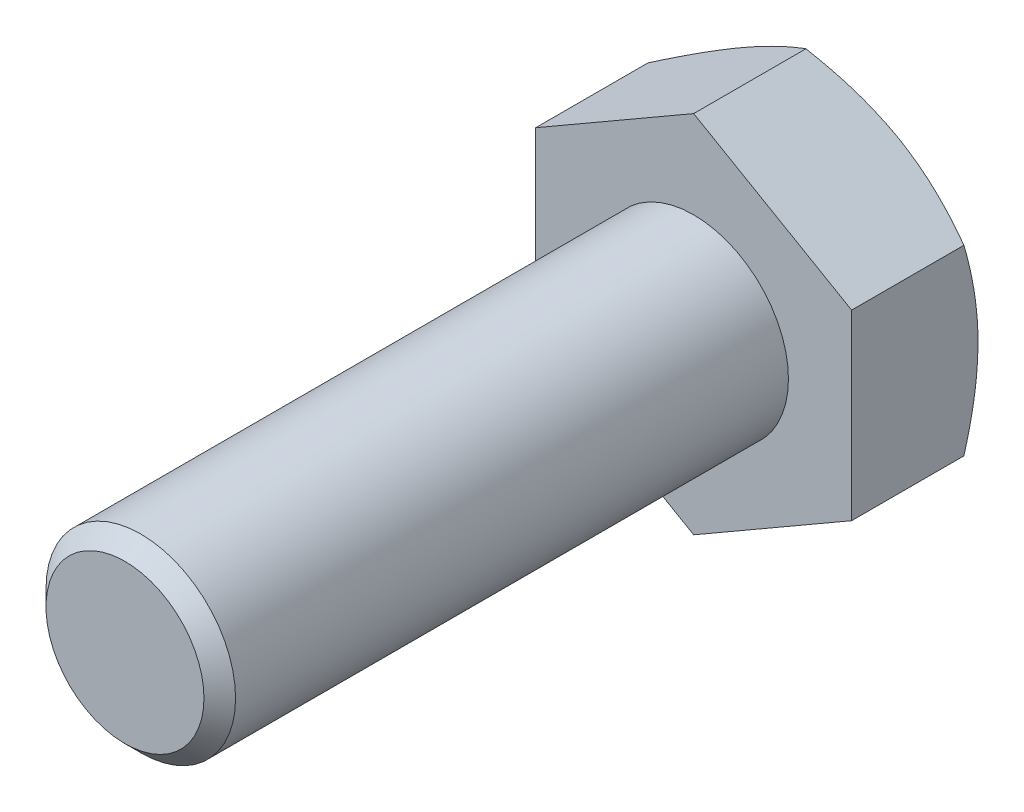
ISO-10303-21;
HEADER;
FILE_DESCRIPTION(('STEP AP214'),'2;1');
FILE_NAME('part.step','',(''),(''),'','','');
FILE_SCHEMA(('AUTOMOTIVE_DESIGN { 1 0 10303 214 1 1 1 1 }'));
ENDSEC;
DATA;
#1=APPLICATION_CONTEXT('core data for automotive mechanical design processes');
#2=APPLICATION_PROTOCOL_DEFINITION('international standard','automotive_design',2000,#1);
#3=PRODUCT_CONTEXT('',#1,'mechanical');
#4=PRODUCT('Part','Part','',(#3));
#5=PRODUCT_RELATED_PRODUCT_CATEGORY('part','',(#4));
#6=PRODUCT_DEFINITION_FORMATION('','',#4);
#7=PRODUCT_DEFINITION_CONTEXT('part definition',#1,'design');
#8=PRODUCT_DEFINITION('design','',#6,#7);
#9=PRODUCT_DEFINITION_SHAPE('','',#8);
#10=(LENGTH_UNIT() NAMED_UNIT(*) SI_UNIT(.MILLI.,.METRE.));
#11=(NAMED_UNIT(*) PLANE_ANGLE_UNIT() SI_UNIT($,.RADIAN.));
#12=(NAMED_UNIT(*) SI_UNIT($,.STERADIAN.) SOLID_ANGLE_UNIT());
#13=UNCERTAINTY_MEASURE_WITH_UNIT(LENGTH_MEASURE(1.E-05),#10,'distance_accuracy_value','');
#14=(GEOMETRIC_REPRESENTATION_CONTEXT(3) GLOBAL_UNCERTAINTY_ASSIGNED_CONTEXT((#13)) GLOBAL_UNIT_ASSIGNED_CONTEXT((#10,
#11,#12)) REPRESENTATION_CONTEXT('',''));
#15=CARTESIAN_POINT('',(0.,0.,0.));
#16=DIRECTION('',(0.,0.,1.));
#17=DIRECTION('',(1.,0.,0.));
#18=AXIS2_PLACEMENT_3D('',#15,#16,#17);
#19=CARTESIAN_POINT('',(-5.,-2.88675134594813,4.));
#20=DIRECTION('',(0.5,0.866025403784439,0.));
#21=DIRECTION('',(-0.866025403784439,0.5,0.));
#22=AXIS2_PLACEMENT_3D('',#19,#20,#21);
#23=PLANE('',#22);
#24=CARTESIAN_POINT('',(0.000199999999997403,-5.7736181619501,0.446648656051828));
#25=CARTESIAN_POINT('',(-0.219534594525189,-5.64675433465071,0.373386567637635));
#26=CARTESIAN_POINT('',(-0.441148584459584,-5.5188054379059,0.306751321918092));
#27=CARTESIAN_POINT('',(-0.888213995453517,-5.26069210252318,0.190438991010811));
#28=CARTESIAN_POINT('',(-1.11367335959078,-5.13052307794721,0.140803049915789));
#29=CARTESIAN_POINT('',(-1.56183230522351,-4.87177839004641,0.0635510254186983));
#30=CARTESIAN_POINT('',(-1.7844620931042,-4.74324302208387,0.0354203782834899));
#31=CARTESIAN_POINT('',(-2.11918990184665,-4.54998783160116,0.0101949219536851));
#32=CARTESIAN_POINT('',(-2.23084219680506,-4.48552534905128,0.00461345976948458));
#33=CARTESIAN_POINT('',(-2.4542499706738,-4.35654081066911,-0.000797783248528982));
#34=CARTESIAN_POINT('',(-2.56600544629032,-4.2920187567385,-0.000627741741795638));
#35=CARTESIAN_POINT('',(-2.87218423085064,-4.11524635305244,0.00775363179203785));
#36=CARTESIAN_POINT('',(-3.06650608596722,-4.00305457769146,0.0218297718972529));
#37=CARTESIAN_POINT('',(-3.45386010199771,-3.77941563226458,0.0664652571094319));
#38=CARTESIAN_POINT('',(-3.64689090137157,-3.66796924828419,0.097039860147509));
#39=CARTESIAN_POINT('',(-4.03502534247486,-3.44387972423144,0.173468493621165));
#40=CARTESIAN_POINT('',(-4.23007999864174,-3.3312648659868,0.219646378878681));
#41=CARTESIAN_POINT('',(-4.61728034535877,-3.10771464157941,0.324451794491935));
#42=CARTESIAN_POINT('',(-4.80943099540809,-2.99677641204847,0.383054703437375));
#43=CARTESIAN_POINT('',(-5.0002,-2.88663587589429,0.446648656051828));
#44=B_SPLINE_CURVE_WITH_KNOTS('',3,(#24,#25,#26,#27,#28,#29,#30,#31,#32,#33,#34,#35,#36,#37,#38,
#39,#40,#41,#42,#43),.UNSPECIFIED.,.F.,.F.,(4,2,2,2,2,2,2,2,2,4),(0.,0.792555841363091,
1.58701660053333,2.36181537487281,2.74884076077325,3.13585419177295,3.80962362599679,
4.48401723901189,5.17336882348928,5.86136694793725),.UNSPECIFIED.);
#45=CARTESIAN_POINT('',(0.,-5.77350269189626,0.446581987385202));
#46=VERTEX_POINT('',#45);
#47=CARTESIAN_POINT('',(-2.5,-4.33012701892219,0.));
#48=VERTEX_POINT('',#47);
#49=EDGE_CURVE('E183',#46,#48,#44,.T.);
#50=ORIENTED_EDGE('',*,*,#49,.F.);
#51=DIRECTION('',(0.,0.,-1.));
#52=VECTOR('',#51,1.);
#53=CARTESIAN_POINT('',(0.,-5.77350269189626,4.));
#54=LINE('',#53,#52);
#55=CARTESIAN_POINT('',(0.,-5.77350269189626,4.));
#56=VERTEX_POINT('',#55);
#57=EDGE_CURVE('E135',#56,#46,#54,.T.);
#58=ORIENTED_EDGE('',*,*,#57,.F.);
#59=DIRECTION('',(0.866025403784439,-0.5,0.));
#60=VECTOR('',#59,1.);
#61=CARTESIAN_POINT('',(-5.,-2.88675134594813,4.));
#62=LINE('',#61,#60);
#63=CARTESIAN_POINT('',(-5.,-2.88675134594813,4.));
#64=VERTEX_POINT('',#63);
#65=EDGE_CURVE('E263',#64,#56,#62,.T.);
#66=ORIENTED_EDGE('',*,*,#65,.F.);
#67=DIRECTION('',(0.,0.,-1.));
#68=VECTOR('',#67,1.);
#69=CARTESIAN_POINT('',(-5.,-2.88675134594813,4.));
#70=LINE('',#69,#68);
#71=CARTESIAN_POINT('',(-5.,-2.88675134594836,0.446581987385049));
#72=VERTEX_POINT('',#71);
#73=EDGE_CURVE('E233',#64,#72,#70,.T.);
#74=ORIENTED_EDGE('',*,*,#73,.T.);
#75=EDGE_CURVE('E177',#48,#72,#44,.T.);
#76=ORIENTED_EDGE('',*,*,#75,.F.);
#77=EDGE_LOOP('',(#50,#58,#66,#74,#76));
#78=FACE_BOUND('',#77,.T.);
#79=ADVANCED_FACE('F38',(#78),#23,.F.);
#80=CARTESIAN_POINT('',(0.,-5.77350269189626,4.));
#81=DIRECTION('',(-0.5,0.866025403784439,0.));
#82=DIRECTION('',(-0.866025403784439,-0.5,0.));
#83=AXIS2_PLACEMENT_3D('',#80,#81,#82);
#84=PLANE('',#83);
#85=CARTESIAN_POINT('',(5.0002,-2.88663587589429,0.446648656051828));
#86=CARTESIAN_POINT('',(4.78046540547481,-3.01349970319368,0.373386567637634));
#87=CARTESIAN_POINT('',(4.55885141554042,-3.14144859993849,0.306751321918091));
#88=CARTESIAN_POINT('',(4.11178600454648,-3.39956193532121,0.19043899101081));
#89=CARTESIAN_POINT('',(3.88632664040922,-3.52973095989718,0.140803049915789));
#90=CARTESIAN_POINT('',(3.43816769477649,-3.78847564779798,0.0635510254186978));
#91=CARTESIAN_POINT('',(3.2155379068958,-3.91701101576052,0.0354203782834894));
#92=CARTESIAN_POINT('',(2.88081009815335,-4.11026620624323,0.0101949219536843));
#93=CARTESIAN_POINT('',(2.76915780319493,-4.17472868879311,0.00461345976948366));
#94=CARTESIAN_POINT('',(2.5457500293262,-4.30371322717528,-0.000797783248529825));
#95=CARTESIAN_POINT('',(2.43399455370968,-4.36823528110589,-0.000627741741796271));
#96=CARTESIAN_POINT('',(2.12781576914936,-4.54500768479195,0.00775363179203759));
#97=CARTESIAN_POINT('',(1.93349391403278,-4.65719946015293,0.0218297718972526));
#98=CARTESIAN_POINT('',(1.54613989800229,-4.88083840557982,0.0664652571094318));
#99=CARTESIAN_POINT('',(1.35310909862843,-4.99228478956021,0.0970398601475088));
#100=CARTESIAN_POINT('',(0.964974657525142,-5.21637431361295,0.173468493621164));
#101=CARTESIAN_POINT('',(0.76992000135826,-5.32898917185759,0.219646378878681));
#102=CARTESIAN_POINT('',(0.382719654641227,-5.55253939626498,0.324451794491935));
#103=CARTESIAN_POINT('',(0.190569004591909,-5.66347762579592,0.383054703437375));
#104=CARTESIAN_POINT('',(-0.000200000000003404,-5.7736181619501,0.446648656051829));
#105=B_SPLINE_CURVE_WITH_KNOTS('',3,(#85,#86,#87,#88,#89,#90,#91,#92,#93,#94,#95,#96,#97,#98,
#99,#100,#101,#102,#103,#104),.UNSPECIFIED.,.F.,.F.,(4,2,2,2,2,2,2,2,2,4),(0.,0.792555841363091,
1.58701660053334,2.36181537487281,2.74884076077326,3.13585419177295,3.80962362599679,
4.48401723901189,5.17336882348929,5.86136694793725),.UNSPECIFIED.);
#106=CARTESIAN_POINT('',(5.,-2.88675134594813,0.446581987385202));
#107=VERTEX_POINT('',#106);
#108=CARTESIAN_POINT('',(2.5,-4.3301270189222,0.));
#109=VERTEX_POINT('',#108);
#110=EDGE_CURVE('E130',#107,#109,#105,.T.);
#111=ORIENTED_EDGE('',*,*,#110,.F.);
#112=DIRECTION('',(0.,0.,-1.));
#113=VECTOR('',#112,1.);
#114=CARTESIAN_POINT('',(5.,-2.88675134594813,4.));
#115=LINE('',#114,#113);
#116=CARTESIAN_POINT('',(5.,-2.88675134594813,4.));
#117=VERTEX_POINT('',#116);
#118=EDGE_CURVE('E144',#117,#107,#115,.T.);
#119=ORIENTED_EDGE('',*,*,#118,.F.);
#120=DIRECTION('',(0.866025403784439,0.5,0.));
#121=VECTOR('',#120,1.);
#122=CARTESIAN_POINT('',(0.,-5.77350269189626,4.));
#123=LINE('',#122,#121);
#124=EDGE_CURVE('E265',#56,#117,#123,.T.);
#125=ORIENTED_EDGE('',*,*,#124,.F.);
#126=ORIENTED_EDGE('',*,*,#57,.T.);
#127=EDGE_CURVE('E154',#109,#46,#105,.T.);
#128=ORIENTED_EDGE('',*,*,#127,.F.);
#129=EDGE_LOOP('',(#111,#119,#125,#126,#128));
#130=FACE_BOUND('',#129,.T.);
#131=ADVANCED_FACE('F167',(#130),#84,.F.);
#132=CARTESIAN_POINT('',(5.,-2.88675134594813,4.));
#133=DIRECTION('',(-1.,0.,0.));
#134=DIRECTION('',(0.,0.,1.));
#135=AXIS2_PLACEMENT_3D('',#132,#133,#134);
#136=PLANE('',#135);
#137=CARTESIAN_POINT('',(5.,-7.8736570188767,2.49824245939977));
#138=CARTESIAN_POINT('',(5.,-7.65421637408501,2.3913190844836));
#139=CARTESIAN_POINT('',(5.,-7.43428458635667,2.28538703571134));
#140=CARTESIAN_POINT('',(5.,-6.99317792778182,2.07606093027014));
#141=CARTESIAN_POINT('',(5.,-6.77200287775446,1.97266725159217));
#142=CARTESIAN_POINT('',(5.,-6.32706593086417,1.76847847627935));
#143=CARTESIAN_POINT('',(5.,-6.10329657096095,1.66769958781428));
#144=CARTESIAN_POINT('',(5.,-5.65401907662692,1.47011021689864));
#145=CARTESIAN_POINT('',(5.,-5.42851102159104,1.37329955450513));
#146=CARTESIAN_POINT('',(5.,-4.96773019079145,1.18149894017086));
#147=CARTESIAN_POINT('',(5.,-4.73238523141451,1.08668148618717));
#148=CARTESIAN_POINT('',(5.,-4.25898650473719,0.90393770173103));
#149=CARTESIAN_POINT('',(5.,-4.02093244346304,0.816012127444709));
#150=CARTESIAN_POINT('',(5.,-3.54214478748224,0.649272765045236));
#151=CARTESIAN_POINT('',(5.,-3.301417327683,0.570441532066683));
#152=CARTESIAN_POINT('',(5.,-2.81651125773827,0.424340890157924));
#153=CARTESIAN_POINT('',(5.,-2.5723337217778,0.357067964795152));
#154=CARTESIAN_POINT('',(5.,-2.08173956311767,0.237589616935799));
#155=CARTESIAN_POINT('',(5.,-1.83534384469814,0.185299904011219));
#156=CARTESIAN_POINT('',(5.,-1.33936717869396,0.0986663483597769));
#157=CARTESIAN_POINT('',(5.,-1.08978658051681,0.0643205540851793));
#158=CARTESIAN_POINT('',(5.,-0.591994652611083,0.0167582844725521));
#159=CARTESIAN_POINT('',(5.,-0.343810846499262,0.00326086545964669));
#160=CARTESIAN_POINT('',(5.,0.15282051482198,-0.00220795227786633));
#161=CARTESIAN_POINT('',(5.,0.401268073866001,0.00582096636622403));
#162=CARTESIAN_POINT('',(5.,0.819539614676472,0.0368800078640876));
#163=CARTESIAN_POINT('',(5.,0.989794934045117,0.0544706947803489));
#164=CARTESIAN_POINT('',(5.,1.32912938793637,0.0987291820663814));
#165=CARTESIAN_POINT('',(5.,1.4982083730453,0.125398114792991));
#166=CARTESIAN_POINT('',(5.,2.00341173301728,0.21762770829236));
#167=CARTESIAN_POINT('',(5.,2.33733597588799,0.295397092852201));
#168=CARTESIAN_POINT('',(5.,2.83691487199414,0.43116893401377));
#169=CARTESIAN_POINT('',(5.,3.00513229800653,0.480286396971534));
#170=CARTESIAN_POINT('',(5.,3.33993504452566,0.583848894650324));
#171=CARTESIAN_POINT('',(5.,3.5065203524313,0.638293970468632));
#172=CARTESIAN_POINT('',(5.,3.83810926585565,0.751619287995437));
#173=CARTESIAN_POINT('',(5.,4.00311330167856,0.810498282125326));
#174=CARTESIAN_POINT('',(5.,4.33173746060676,0.931976168622892));
#175=CARTESIAN_POINT('',(5.,4.49535761540596,0.994574975533726));
#176=CARTESIAN_POINT('',(5.,4.93598294300644,1.16798049532992));
#177=CARTESIAN_POINT('',(5.,5.21182602366742,1.28173733098254));
#178=CARTESIAN_POINT('',(5.,5.76066658468267,1.51594414369696));
#179=CARTESIAN_POINT('',(5.,6.03366374395568,1.63639486647261));
#180=CARTESIAN_POINT('',(5.,6.57746623823241,1.88240390456995));
#181=CARTESIAN_POINT('',(5.,6.84827068606626,2.00796417441533));
#182=CARTESIAN_POINT('',(5.,7.38802449320275,2.26296941169567));
#183=CARTESIAN_POINT('',(5.,7.65697392790879,2.39241422007198));
#184=CARTESIAN_POINT('',(5.,8.1938194026489,2.65455210376313));
#185=CARTESIAN_POINT('',(5.,8.46171304378486,2.78725008178862));
#186=CARTESIAN_POINT('',(5.,8.99628800444128,3.05506690754901));
#187=CARTESIAN_POINT('',(5.,9.26296931379112,3.19018577554669));
#188=CARTESIAN_POINT('',(5.,10.0614145317378,3.59837260398299));
#189=CARTESIAN_POINT('',(5.,10.5917004378745,3.87433030896505));
#190=CARTESIAN_POINT('',(5.,11.5934978261984,4.40186932093089));
#191=CARTESIAN_POINT('',(5.,12.0652823432174,4.65293465311963));
#192=CARTESIAN_POINT('',(5.,13.0072652089827,5.15809174371917));
#193=CARTESIAN_POINT('',(5.,13.4774634574011,5.41218368911634));
#194=CARTESIAN_POINT('',(5.,14.4150598997455,5.92174727964069));
#195=CARTESIAN_POINT('',(5.,14.8824621908533,6.17721139782639));
#196=CARTESIAN_POINT('',(5.,15.8162766578095,6.68985606252667));
#197=CARTESIAN_POINT('',(5.,16.2826889092875,6.94703647122064));
#198=CARTESIAN_POINT('',(5.,16.7487534511426,7.20484156047915));
#199=B_SPLINE_CURVE_WITH_KNOTS('',3,(#137,#138,#139,#140,#141,#142,#143,#144,#145,#146,#147,
#148,#149,#150,#151,#152,#153,#154,#155,#156,#157,#158,#159,#160,#161,#162,#163,#164,#165,#166,
#167,#168,#169,#170,#171,#172,#173,#174,#175,#176,#177,#178,#179,#180,#181,#182,#183,#184,#185,
#186,#187,#188,#189,#190,#191,#192,#193,#194,#195,#196,#197,#198),.UNSPECIFIED.,.F.,.F.,(4,2,2,
2,2,2,2,2,2,2,2,2,2,2,2,2,2,2,2,2,2,2,2,2,2,2,2,2,2,2,4),(0.,0.732320649228783,1.46474969554234,
2.20096737715445,2.93715163726605,3.69825037836021,4.45943251165485,5.21912936588069,
5.97859468349107,6.73369963721938,7.48872245001083,8.23347928786148,8.97824710592677,
9.49148539016022,10.0047877156168,11.0318914624583,11.5575684291884,12.0832494513179,
12.6087831104645,13.1343047009664,14.0293094369911,14.9244140791771,15.819864399481,
16.7152781040304,17.612136124032,18.5090016542186,20.3023290058613,21.9056050637106,
23.5089806922305,25.106957271978,26.7048070399876),.UNSPECIFIED.);
#200=CARTESIAN_POINT('',(5.,2.88675134594813,0.446581987385201));
#201=VERTEX_POINT('',#200);
#202=CARTESIAN_POINT('',(5.,0.,0.));
#203=VERTEX_POINT('',#202);
#204=EDGE_CURVE('E109',#201,#203,#199,.F.);
#205=ORIENTED_EDGE('',*,*,#204,.F.);
#206=DIRECTION('',(0.,0.,-1.));
#207=VECTOR('',#206,1.);
#208=CARTESIAN_POINT('',(5.,2.88675134594813,4.));
#209=LINE('',#208,#207);
#210=CARTESIAN_POINT('',(5.,2.88675134594813,4.));
#211=VERTEX_POINT('',#210);
#212=EDGE_CURVE('E235',#211,#201,#209,.T.);
#213=ORIENTED_EDGE('',*,*,#212,.F.);
#214=DIRECTION('',(0.,1.,0.));
#215=VECTOR('',#214,1.);
#216=CARTESIAN_POINT('',(5.,-2.88675134594813,4.));
#217=LINE('',#216,#215);
#218=EDGE_CURVE('E269',#117,#211,#217,.T.);
#219=ORIENTED_EDGE('',*,*,#218,.F.);
#220=ORIENTED_EDGE('',*,*,#118,.T.);
#221=EDGE_CURVE('E122',#203,#107,#199,.F.);
#222=ORIENTED_EDGE('',*,*,#221,.F.);
#223=EDGE_LOOP('',(#205,#213,#219,#220,#222));
#224=FACE_BOUND('',#223,.T.);
#225=ADVANCED_FACE('F141',(#224),#136,.F.);
#226=CARTESIAN_POINT('',(5.,2.88675134594813,4.));
#227=DIRECTION('',(-0.5,-0.866025403784439,0.));
#228=DIRECTION('',(0.866025403784439,-0.5,0.));
#229=AXIS2_PLACEMENT_3D('',#226,#227,#228);
#230=PLANE('',#229);
#231=CARTESIAN_POINT('',(-0.000199999999999335,5.7736181619501,0.446648656051829));
#232=CARTESIAN_POINT('',(0.219534594525186,5.64675433465071,0.373386567637635));
#233=CARTESIAN_POINT('',(0.441148584459582,5.5188054379059,0.306751321918093));
#234=CARTESIAN_POINT('',(0.888213995453515,5.26069210252318,0.190438991010811));
#235=CARTESIAN_POINT('',(1.11367335959078,5.13052307794721,0.140803049915789));
#236=CARTESIAN_POINT('',(1.56183230522351,4.87177839004641,0.0635510254186977));
#237=CARTESIAN_POINT('',(1.78446209310419,4.74324302208387,0.0354203782834893));
#238=CARTESIAN_POINT('',(2.11918990184664,4.54998783160116,0.0101949219536847));
#239=CARTESIAN_POINT('',(2.23084219680506,4.48552534905128,0.00461345976948423));
#240=CARTESIAN_POINT('',(2.4542499706738,4.35654081066911,-0.000797783248529397));
#241=CARTESIAN_POINT('',(2.56600544629032,4.2920187567385,-0.000627741741796181));
#242=CARTESIAN_POINT('',(2.87218423085064,4.11524635305244,0.00775363179203707));
#243=CARTESIAN_POINT('',(3.06650608596721,4.00305457769146,0.0218297718972521));
#244=CARTESIAN_POINT('',(3.45386010199771,3.77941563226457,0.0664652571094311));
#245=CARTESIAN_POINT('',(3.64689090137157,3.66796924828419,0.0970398601475081));
#246=CARTESIAN_POINT('',(4.03502534247485,3.44387972423144,0.173468493621163));
#247=CARTESIAN_POINT('',(4.23007999864173,3.3312648659868,0.21964637887868));
#248=CARTESIAN_POINT('',(4.61728034535877,3.10771464157941,0.324451794491934));
#249=CARTESIAN_POINT('',(4.80943099540808,2.99677641204847,0.383054703437374));
#250=CARTESIAN_POINT('',(5.0002,2.88663587589429,0.446648656051828));
#251=B_SPLINE_CURVE_WITH_KNOTS('',3,(#231,#232,#233,#234,#235,#236,#237,#238,#239,#240,#241,
#242,#243,#244,#245,#246,#247,#248,#249,#250),.UNSPECIFIED.,.F.,.F.,(4,2,2,2,2,2,2,2,2,4),(0.,
0.792555841363092,1.58701660053334,2.36181537487281,2.74884076077325,3.13585419177295,
3.80962362599679,4.48401723901189,5.17336882348928,5.86136694793725),.UNSPECIFIED.);
#252=CARTESIAN_POINT('',(0.,5.77350269189626,0.446581987385202));
#253=VERTEX_POINT('',#252);
#254=CARTESIAN_POINT('',(2.5,4.33012701892219,0.));
#255=VERTEX_POINT('',#254);
#256=EDGE_CURVE('E53',#253,#255,#251,.T.);
#257=ORIENTED_EDGE('',*,*,#256,.F.);
#258=DIRECTION('',(0.,0.,-1.));
#259=VECTOR('',#258,1.);
#260=CARTESIAN_POINT('',(0.,5.77350269189626,4.));
#261=LINE('',#260,#259);
#262=CARTESIAN_POINT('',(0.,5.77350269189626,4.));
#263=VERTEX_POINT('',#262);
#264=EDGE_CURVE('E232',#263,#253,#261,.T.);
#265=ORIENTED_EDGE('',*,*,#264,.F.);
#266=DIRECTION('',(-0.866025403784439,0.5,0.));
#267=VECTOR('',#266,1.);
#268=CARTESIAN_POINT('',(5.,2.88675134594813,4.));
#269=LINE('',#268,#267);
#270=EDGE_CURVE('E273',#211,#263,#269,.T.);
#271=ORIENTED_EDGE('',*,*,#270,.F.);
#272=ORIENTED_EDGE('',*,*,#212,.T.);
#273=EDGE_CURVE('E116',#255,#201,#251,.T.);
#274=ORIENTED_EDGE('',*,*,#273,.F.);
#275=EDGE_LOOP('',(#257,#265,#271,#272,#274));
#276=FACE_BOUND('',#275,.T.);
#277=ADVANCED_FACE('F166',(#276),#230,.F.);
#278=CARTESIAN_POINT('',(0.,5.77350269189626,4.));
#279=DIRECTION('',(0.5,-0.866025403784439,0.));
#280=DIRECTION('',(0.866025403784439,0.5,0.));
#281=AXIS2_PLACEMENT_3D('',#278,#279,#280);
#282=PLANE('',#281);
#283=CARTESIAN_POINT('',(-5.0002,2.88663587589429,0.446648656051829));
#284=CARTESIAN_POINT('',(-4.78046540547482,3.01349970319368,0.373386567637635));
#285=CARTESIAN_POINT('',(-4.55885141554042,3.14144859993849,0.306751321918092));
#286=CARTESIAN_POINT('',(-4.11178600454649,3.39956193532121,0.190438991010811));
#287=CARTESIAN_POINT('',(-3.88632664040923,3.52973095989718,0.140803049915789));
#288=CARTESIAN_POINT('',(-3.43816769477649,3.78847564779798,0.0635510254186984));
#289=CARTESIAN_POINT('',(-3.21553790689581,3.91701101576052,0.0354203782834897));
#290=CARTESIAN_POINT('',(-2.88081009815336,4.11026620624323,0.0101949219536848));
#291=CARTESIAN_POINT('',(-2.76915780319494,4.17472868879311,0.00461345976948434));
#292=CARTESIAN_POINT('',(-2.5457500293262,4.30371322717528,-0.000797783248529498));
#293=CARTESIAN_POINT('',(-2.43399455370968,4.36823528110589,-0.00062774174179644));
#294=CARTESIAN_POINT('',(-2.12781576914936,4.54500768479195,0.00775363179203686));
#295=CARTESIAN_POINT('',(-1.93349391403278,4.65719946015293,0.0218297718972525));
#296=CARTESIAN_POINT('',(-1.54613989800229,4.88083840557981,0.0664652571094321));
#297=CARTESIAN_POINT('',(-1.35310909862843,4.9922847895602,0.0970398601475091));
#298=CARTESIAN_POINT('',(-0.964974657525144,5.21637431361295,0.173468493621164));
#299=CARTESIAN_POINT('',(-0.769920001358262,5.32898917185759,0.219646378878681));
#300=CARTESIAN_POINT('',(-0.38271965464123,5.55253939626498,0.324451794491934));
#301=CARTESIAN_POINT('',(-0.190569004591912,5.66347762579592,0.383054703437374));
#302=CARTESIAN_POINT('',(0.000200000000000848,5.7736181619501,0.446648656051829));
#303=B_SPLINE_CURVE_WITH_KNOTS('',3,(#283,#284,#285,#286,#287,#288,#289,#290,#291,#292,#293,
#294,#295,#296,#297,#298,#299,#300,#301,#302),.UNSPECIFIED.,.F.,.F.,(4,2,2,2,2,2,2,2,2,4),(0.,
0.792555841363091,1.58701660053334,2.36181537487281,2.74884076077326,3.13585419177295,
3.80962362599679,4.48401723901189,5.17336882348929,5.86136694793725),.UNSPECIFIED.);
#304=CARTESIAN_POINT('',(-5.,2.88675134594813,0.446581987385202));
#305=VERTEX_POINT('',#304);
#306=CARTESIAN_POINT('',(-2.5,4.3301270189222,0.));
#307=VERTEX_POINT('',#306);
#308=EDGE_CURVE('E61',#305,#307,#303,.T.);
#309=ORIENTED_EDGE('',*,*,#308,.F.);
#310=DIRECTION('',(0.,0.,-1.));
#311=VECTOR('',#310,1.);
#312=CARTESIAN_POINT('',(-5.,2.88675134594813,4.));
#313=LINE('',#312,#311);
#314=CARTESIAN_POINT('',(-5.,2.88675134594813,4.));
#315=VERTEX_POINT('',#314);
#316=EDGE_CURVE('E227',#315,#305,#313,.T.);
#317=ORIENTED_EDGE('',*,*,#316,.F.);
#318=DIRECTION('',(-0.866025403784439,-0.5,0.));
#319=VECTOR('',#318,1.);
#320=CARTESIAN_POINT('',(0.,5.77350269189626,4.));
#321=LINE('',#320,#319);
#322=EDGE_CURVE('E275',#263,#315,#321,.T.);
#323=ORIENTED_EDGE('',*,*,#322,.F.);
#324=ORIENTED_EDGE('',*,*,#264,.T.);
#325=EDGE_CURVE('E193',#307,#253,#303,.T.);
#326=ORIENTED_EDGE('',*,*,#325,.F.);
#327=EDGE_LOOP('',(#309,#317,#323,#324,#326));
#328=FACE_BOUND('',#327,.T.);
#329=ADVANCED_FACE('F214',(#328),#282,.F.);
#330=CARTESIAN_POINT('',(-5.,2.88675134594813,4.));
#331=DIRECTION('',(1.,0.,0.));
#332=DIRECTION('',(0.,0.,-1.));
#333=AXIS2_PLACEMENT_3D('',#330,#331,#332);
#334=PLANE('',#333);
#335=CARTESIAN_POINT('',(-5.,-7.8736570188767,2.49824245939977));
#336=CARTESIAN_POINT('',(-5.,-7.65421637408502,2.3913190844836));
#337=CARTESIAN_POINT('',(-5.,-7.43428458635667,2.28538703571135));
#338=CARTESIAN_POINT('',(-5.,-6.99317792778182,2.07606093027014));
#339=CARTESIAN_POINT('',(-5.,-6.77200287775447,1.97266725159217));
#340=CARTESIAN_POINT('',(-5.,-6.32706593086417,1.76847847627935));
#341=CARTESIAN_POINT('',(-5.,-6.10329657096095,1.66769958781428));
#342=CARTESIAN_POINT('',(-5.,-5.65401907662692,1.47011021689865));
#343=CARTESIAN_POINT('',(-5.,-5.42851102159104,1.37329955450513));
#344=CARTESIAN_POINT('',(-5.,-4.96773019079145,1.18149894017086));
#345=CARTESIAN_POINT('',(-5.,-4.73238523141451,1.08668148618717));
#346=CARTESIAN_POINT('',(-5.,-4.25898650473719,0.90393770173103));
#347=CARTESIAN_POINT('',(-5.,-4.02093244346304,0.816012127444709));
#348=CARTESIAN_POINT('',(-5.,-3.54214478748224,0.649272765045237));
#349=CARTESIAN_POINT('',(-5.,-3.30141732768299,0.570441532066684));
#350=CARTESIAN_POINT('',(-5.,-2.81651125773827,0.424340890157925));
#351=CARTESIAN_POINT('',(-5.,-2.5723337217778,0.357067964795154));
#352=CARTESIAN_POINT('',(-5.,-2.08173956311767,0.2375896169358));
#353=CARTESIAN_POINT('',(-5.,-1.83534384469814,0.185299904011219));
#354=CARTESIAN_POINT('',(-5.,-1.33936717869396,0.0986663483597776));
#355=CARTESIAN_POINT('',(-5.,-1.08978658051681,0.0643205540851806));
#356=CARTESIAN_POINT('',(-5.,-0.59199465261108,0.0167582844725538));
#357=CARTESIAN_POINT('',(-5.,-0.343810846499259,0.0032608654596481));
#358=CARTESIAN_POINT('',(-5.,0.152820514821983,-0.00220795227786472));
#359=CARTESIAN_POINT('',(-5.,0.401268073866004,0.00582096636622599));
#360=CARTESIAN_POINT('',(-5.,0.819539614676475,0.0368800078640897));
#361=CARTESIAN_POINT('',(-5.,0.98979493404512,0.0544706947803509));
#362=CARTESIAN_POINT('',(-5.,1.32912938793638,0.0987291820663835));
#363=CARTESIAN_POINT('',(-5.,1.4982083730453,0.125398114792993));
#364=CARTESIAN_POINT('',(-5.,2.00341173301729,0.217627708292362));
#365=CARTESIAN_POINT('',(-5.,2.337335975888,0.295397092852203));
#366=CARTESIAN_POINT('',(-5.,2.83691487199415,0.431168934013773));
#367=CARTESIAN_POINT('',(-5.,3.00513229800654,0.480286396971537));
#368=CARTESIAN_POINT('',(-5.,3.33993504452566,0.583848894650327));
#369=CARTESIAN_POINT('',(-5.,3.50652035243131,0.638293970468636));
#370=CARTESIAN_POINT('',(-5.,3.83810926585566,0.751619287995441));
#371=CARTESIAN_POINT('',(-5.,4.00311330167857,0.81049828212533));
#372=CARTESIAN_POINT('',(-5.,4.33173746060676,0.931976168622897));
#373=CARTESIAN_POINT('',(-5.,4.49535761540597,0.994574975533731));
#374=CARTESIAN_POINT('',(-5.,4.93598294300645,1.16798049532993));
#375=CARTESIAN_POINT('',(-5.,5.21182602366743,1.28173733098254));
#376=CARTESIAN_POINT('',(-5.,5.76066658468268,1.51594414369696));
#377=CARTESIAN_POINT('',(-5.,6.03366374395569,1.63639486647261));
#378=CARTESIAN_POINT('',(-5.,6.57746623823242,1.88240390456995));
#379=CARTESIAN_POINT('',(-5.,6.84827068606627,2.00796417441533));
#380=CARTESIAN_POINT('',(-5.,7.38802449320276,2.26296941169568));
#381=CARTESIAN_POINT('',(-5.,7.6569739279088,2.39241422007198));
#382=CARTESIAN_POINT('',(-5.,8.19381940264891,2.65455210376314));
#383=CARTESIAN_POINT('',(-5.,8.46171304378487,2.78725008178863));
#384=CARTESIAN_POINT('',(-5.,8.9962880044413,3.05506690754902));
#385=CARTESIAN_POINT('',(-5.,9.26296931379112,3.1901857755467));
#386=CARTESIAN_POINT('',(-5.,10.0614145317378,3.598372603983));
#387=CARTESIAN_POINT('',(-5.,10.5917004378745,3.87433030896505));
#388=CARTESIAN_POINT('',(-5.,11.5934978261984,4.40186932093089));
#389=CARTESIAN_POINT('',(-5.,12.0652823432174,4.65293465311963));
#390=CARTESIAN_POINT('',(-5.,13.0072652089827,5.15809174371918));
#391=CARTESIAN_POINT('',(-5.,13.4774634574011,5.41218368911634));
#392=CARTESIAN_POINT('',(-5.,14.4150598997455,5.92174727964069));
#393=CARTESIAN_POINT('',(-5.,14.8824621908533,6.17721139782639));
#394=CARTESIAN_POINT('',(-5.,15.8162766578095,6.68985606252667));
#395=CARTESIAN_POINT('',(-5.,16.2826889092875,6.94703647122064));
#396=CARTESIAN_POINT('',(-5.,16.7487534511426,7.20484156047915));
#397=B_SPLINE_CURVE_WITH_KNOTS('',3,(#335,#336,#337,#338,#339,#340,#341,#342,#343,#344,#345,
#346,#347,#348,#349,#350,#351,#352,#353,#354,#355,#356,#357,#358,#359,#360,#361,#362,#363,#364,
#365,#366,#367,#368,#369,#370,#371,#372,#373,#374,#375,#376,#377,#378,#379,#380,#381,#382,#383,
#384,#385,#386,#387,#388,#389,#390,#391,#392,#393,#394,#395,#396),.UNSPECIFIED.,.F.,.F.,(4,2,2,
2,2,2,2,2,2,2,2,2,2,2,2,2,2,2,2,2,2,2,2,2,2,2,2,2,2,2,4),(0.,0.732320649228781,1.46474969554234,
2.20096737715445,2.93715163726605,3.69825037836021,4.45943251165485,5.21912936588069,
5.97859468349107,6.73369963721938,7.48872245001083,8.23347928786149,8.97824710592677,
9.49148539016022,10.0047877156168,11.0318914624583,11.5575684291884,12.0832494513179,
12.6087831104645,13.1343047009664,14.0293094369911,14.9244140791771,15.819864399481,
16.7152781040304,17.612136124032,18.5090016542186,20.3023290058613,21.9056050637106,
23.5089806922305,25.106957271978,26.7048070399876),.UNSPECIFIED.);
#398=CARTESIAN_POINT('',(-5.,0.,0.));
#399=VERTEX_POINT('',#398);
#400=EDGE_CURVE('E195',#72,#399,#397,.T.);
#401=ORIENTED_EDGE('',*,*,#400,.F.);
#402=ORIENTED_EDGE('',*,*,#73,.F.);
#403=DIRECTION('',(0.,-1.,0.));
#404=VECTOR('',#403,1.);
#405=CARTESIAN_POINT('',(-5.,2.88675134594813,4.));
#406=LINE('',#405,#404);
#407=EDGE_CURVE('E231',#315,#64,#406,.T.);
#408=ORIENTED_EDGE('',*,*,#407,.F.);
#409=ORIENTED_EDGE('',*,*,#316,.T.);
#410=EDGE_CURVE('E197',#399,#305,#397,.T.);
#411=ORIENTED_EDGE('',*,*,#410,.F.);
#412=EDGE_LOOP('',(#401,#402,#408,#409,#411));
#413=FACE_BOUND('',#412,.T.);
#414=ADVANCED_FACE('F209',(#413),#334,.F.);
#415=CARTESIAN_POINT('',(0.,0.,4.));
#416=DIRECTION('',(0.,0.,1.));
#417=DIRECTION('',(1.,0.,0.));
#418=AXIS2_PLACEMENT_3D('',#415,#416,#417);
#419=PLANE('',#418);
#420=CARTESIAN_POINT('',(0.,0.,4.));
#421=DIRECTION('',(0.,0.,1.));
#422=DIRECTION('',(1.,0.,0.));
#423=AXIS2_PLACEMENT_3D('',#420,#421,#422);
#424=CIRCLE('',#423,3.);
#425=CARTESIAN_POINT('',(3.,0.,4.));
#426=VERTEX_POINT('',#425);
#427=EDGE_CURVE('E121',#426,#426,#424,.T.);
#428=ORIENTED_EDGE('',*,*,#427,.F.);
#429=EDGE_LOOP('',(#428));
#430=FACE_BOUND('',#429,.T.);
#431=ORIENTED_EDGE('',*,*,#65,.T.);
#432=ORIENTED_EDGE('',*,*,#124,.T.);
#433=ORIENTED_EDGE('',*,*,#218,.T.);
#434=ORIENTED_EDGE('',*,*,#270,.T.);
#435=ORIENTED_EDGE('',*,*,#322,.T.);
#436=ORIENTED_EDGE('',*,*,#407,.T.);
#437=EDGE_LOOP('',(#431,#432,#433,#434,#435,#436));
#438=FACE_BOUND('',#437,.T.);
#439=ADVANCED_FACE('F213',(#430,#438),#419,.T.);
#440=CARTESIAN_POINT('',(0.,0.,22.));
#441=DIRECTION('',(0.,0.,-1.));
#442=DIRECTION('',(-1.,0.,0.));
#443=AXIS2_PLACEMENT_3D('',#440,#441,#442);
#444=CYLINDRICAL_SURFACE('',#443,3.);
#445=CARTESIAN_POINT('',(0.,0.,21.5));
#446=DIRECTION('',(0.,0.,1.));
#447=DIRECTION('',(1.,0.,0.));
#448=AXIS2_PLACEMENT_3D('',#445,#446,#447);
#449=CIRCLE('',#448,3.);
#450=CARTESIAN_POINT('',(3.,0.,21.5));
#451=VERTEX_POINT('',#450);
#452=EDGE_CURVE('E12',#451,#451,#449,.F.);
#453=ORIENTED_EDGE('',*,*,#452,.T.);
#454=EDGE_LOOP('',(#453));
#455=FACE_BOUND('',#454,.T.);
#456=ORIENTED_EDGE('',*,*,#427,.T.);
#457=EDGE_LOOP('',(#456));
#458=FACE_BOUND('',#457,.T.);
#459=ADVANCED_FACE('F256',(#455,#458),#444,.T.);
#460=CARTESIAN_POINT('',(0.,0.,22.));
#461=DIRECTION('',(0.,0.,1.));
#462=DIRECTION('',(1.,0.,0.));
#463=AXIS2_PLACEMENT_3D('',#460,#461,#462);
#464=PLANE('',#463);
#465=CARTESIAN_POINT('',(0.,0.,22.));
#466=DIRECTION('',(0.,0.,1.));
#467=DIRECTION('',(1.,0.,0.));
#468=AXIS2_PLACEMENT_3D('',#465,#466,#467);
#469=CIRCLE('',#468,2.5);
#470=CARTESIAN_POINT('',(2.5,0.,22.));
#471=VERTEX_POINT('',#470);
#472=EDGE_CURVE('E46',#471,#471,#469,.T.);
#473=ORIENTED_EDGE('',*,*,#472,.T.);
#474=EDGE_LOOP('',(#473));
#475=FACE_BOUND('',#474,.T.);
#476=ADVANCED_FACE('F247',(#475),#464,.T.);
#477=CARTESIAN_POINT('',(0.,0.,0.));
#478=DIRECTION('',(0.,0.,1.));
#479=DIRECTION('',(-1.,0.,0.));
#480=AXIS2_PLACEMENT_3D('',#477,#478,#479);
#481=CONICAL_SURFACE('',#480,5.,1.0471975511966);
#482=ORIENTED_EDGE('',*,*,#221,.T.);
#483=ORIENTED_EDGE('',*,*,#110,.T.);
#484=CARTESIAN_POINT('',(0.,0.,0.));
#485=DIRECTION('',(0.,0.,1.));
#486=DIRECTION('',(1.,0.,0.));
#487=AXIS2_PLACEMENT_3D('',#484,#485,#486);
#488=CIRCLE('',#487,5.);
#489=EDGE_CURVE('E127',#109,#203,#488,.T.);
#490=ORIENTED_EDGE('',*,*,#489,.T.);
#491=EDGE_LOOP('',(#482,#483,#490));
#492=FACE_BOUND('',#491,.T.);
#493=ADVANCED_FACE('F128',(#492),#481,.T.);
#494=ORIENTED_EDGE('',*,*,#127,.T.);
#495=ORIENTED_EDGE('',*,*,#49,.T.);
#496=EDGE_CURVE('E134',#48,#109,#488,.T.);
#497=ORIENTED_EDGE('',*,*,#496,.T.);
#498=EDGE_LOOP('',(#494,#495,#497));
#499=FACE_BOUND('',#498,.T.);
#500=ADVANCED_FACE('F281',(#499),#481,.T.);
#501=ORIENTED_EDGE('',*,*,#75,.T.);
#502=ORIENTED_EDGE('',*,*,#400,.T.);
#503=EDGE_CURVE('E282',#399,#48,#488,.T.);
#504=ORIENTED_EDGE('',*,*,#503,.T.);
#505=EDGE_LOOP('',(#501,#502,#504));
#506=FACE_BOUND('',#505,.T.);
#507=ADVANCED_FACE('F286',(#506),#481,.T.);
#508=ORIENTED_EDGE('',*,*,#308,.T.);
#509=CARTESIAN_POINT('',(0.,0.,0.));
#510=DIRECTION('',(0.,0.,-1.));
#511=DIRECTION('',(-1.,0.,0.));
#512=AXIS2_PLACEMENT_3D('',#509,#510,#511);
#513=CIRCLE('',#512,5.);
#514=EDGE_CURVE('E202',#399,#307,#513,.T.);
#515=ORIENTED_EDGE('',*,*,#514,.F.);
#516=ORIENTED_EDGE('',*,*,#410,.T.);
#517=EDGE_LOOP('',(#508,#515,#516));
#518=FACE_BOUND('',#517,.T.);
#519=ADVANCED_FACE('F284',(#518),#481,.T.);
#520=ORIENTED_EDGE('',*,*,#256,.T.);
#521=EDGE_CURVE('E139',#255,#307,#488,.T.);
#522=ORIENTED_EDGE('',*,*,#521,.T.);
#523=ORIENTED_EDGE('',*,*,#325,.T.);
#524=EDGE_LOOP('',(#520,#522,#523));
#525=FACE_BOUND('',#524,.T.);
#526=ADVANCED_FACE('F283',(#525),#481,.T.);
#527=ORIENTED_EDGE('',*,*,#204,.T.);
#528=EDGE_CURVE('E113',#203,#255,#488,.T.);
#529=ORIENTED_EDGE('',*,*,#528,.T.);
#530=ORIENTED_EDGE('',*,*,#273,.T.);
#531=EDGE_LOOP('',(#527,#529,#530));
#532=FACE_BOUND('',#531,.T.);
#533=ADVANCED_FACE('F111',(#532),#481,.T.);
#534=CARTESIAN_POINT('',(0.,0.,0.));
#535=DIRECTION('',(0.,0.,1.));
#536=DIRECTION('',(1.,0.,0.));
#537=AXIS2_PLACEMENT_3D('',#534,#535,#536);
#538=PLANE('',#537);
#539=ORIENTED_EDGE('',*,*,#528,.F.);
#540=ORIENTED_EDGE('',*,*,#489,.F.);
#541=ORIENTED_EDGE('',*,*,#496,.F.);
#542=ORIENTED_EDGE('',*,*,#503,.F.);
#543=ORIENTED_EDGE('',*,*,#514,.T.);
#544=ORIENTED_EDGE('',*,*,#521,.F.);
#545=EDGE_LOOP('',(#539,#540,#541,#542,#543,#544));
#546=FACE_BOUND('',#545,.T.);
#547=ADVANCED_FACE('F137',(#546),#538,.F.);
#548=CARTESIAN_POINT('',(0.,0.,22.));
#549=DIRECTION('',(0.,0.,-1.));
#550=DIRECTION('',(-1.,0.,0.));
#551=AXIS2_PLACEMENT_3D('',#548,#549,#550);
#552=CONICAL_SURFACE('',#551,2.5,0.78539816339745);
#553=ORIENTED_EDGE('',*,*,#452,.F.);
#554=EDGE_LOOP('',(#553));
#555=FACE_BOUND('',#554,.T.);
#556=ORIENTED_EDGE('',*,*,#472,.F.);
#557=EDGE_LOOP('',(#556));
#558=FACE_BOUND('',#557,.T.);
#559=ADVANCED_FACE('F40',(#555,#558),#552,.T.);
#560=CLOSED_SHELL('',(#79,#131,#225,#277,#329,#414,#439,#459,#476,#493,#500,#507,#519,#526,#533,
#547,#559));
#561=MANIFOLD_SOLID_BREP('B2',#560);
#562=ADVANCED_BREP_SHAPE_REPRESENTATION('',(#18,#561),#14);
#563=SHAPE_DEFINITION_REPRESENTATION(#9,#562);
ENDSEC;
END-ISO-10303-21;
